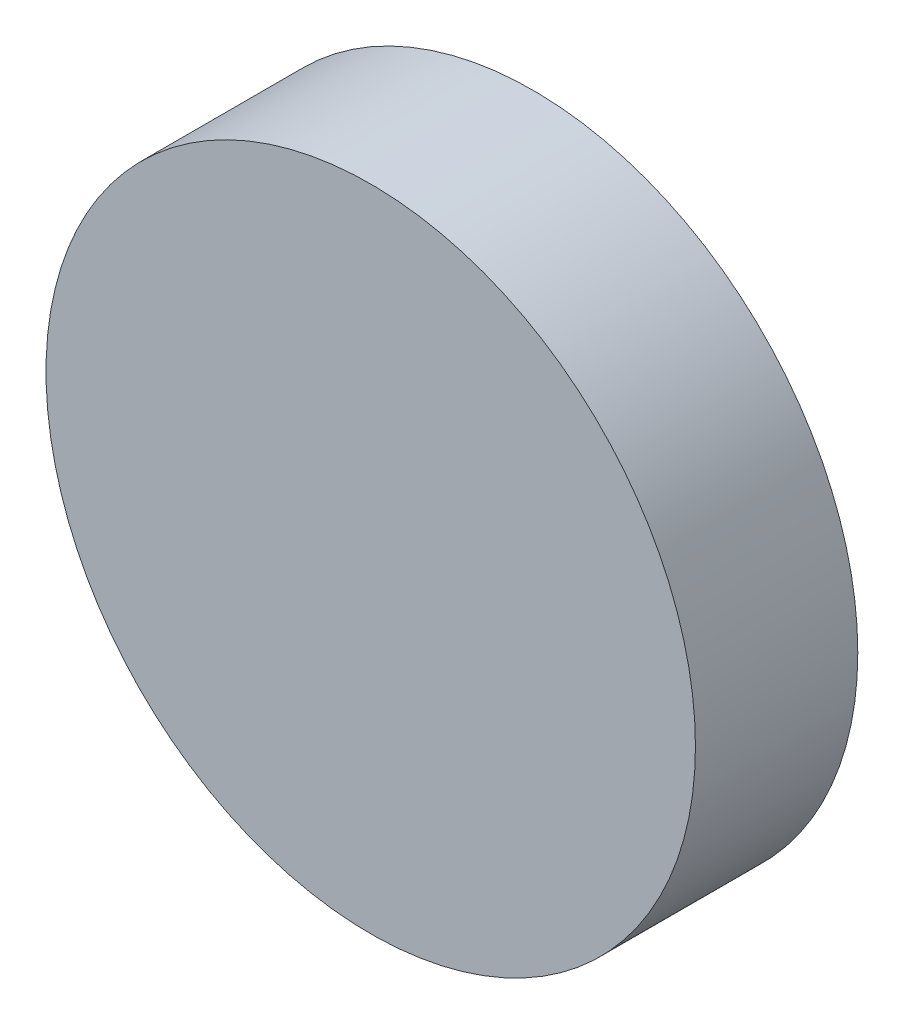
ISO-10303-21;
HEADER;
FILE_DESCRIPTION(('STEP AP214'),'2;1');
FILE_NAME('part.step','',(''),(''),'','','');
FILE_SCHEMA(('AUTOMOTIVE_DESIGN { 1 0 10303 214 1 1 1 1 }'));
ENDSEC;
DATA;
#1=APPLICATION_CONTEXT('core data for automotive mechanical design processes');
#2=APPLICATION_PROTOCOL_DEFINITION('international standard','automotive_design',2000,#1);
#3=PRODUCT_CONTEXT('',#1,'mechanical');
#4=PRODUCT('Part','Part','',(#3));
#5=PRODUCT_RELATED_PRODUCT_CATEGORY('part','',(#4));
#6=PRODUCT_DEFINITION_FORMATION('','',#4);
#7=PRODUCT_DEFINITION_CONTEXT('part definition',#1,'design');
#8=PRODUCT_DEFINITION('design','',#6,#7);
#9=PRODUCT_DEFINITION_SHAPE('','',#8);
#10=(LENGTH_UNIT() NAMED_UNIT(*) SI_UNIT(.MILLI.,.METRE.));
#11=(NAMED_UNIT(*) PLANE_ANGLE_UNIT() SI_UNIT($,.RADIAN.));
#12=(NAMED_UNIT(*) SI_UNIT($,.STERADIAN.) SOLID_ANGLE_UNIT());
#13=UNCERTAINTY_MEASURE_WITH_UNIT(LENGTH_MEASURE(1.E-05),#10,'distance_accuracy_value','');
#14=(GEOMETRIC_REPRESENTATION_CONTEXT(3) GLOBAL_UNCERTAINTY_ASSIGNED_CONTEXT((#13)) GLOBAL_UNIT_ASSIGNED_CONTEXT((#10,
#11,#12)) REPRESENTATION_CONTEXT('',''));
#15=CARTESIAN_POINT('',(0.,0.,0.));
#16=DIRECTION('',(0.,0.,1.));
#17=DIRECTION('',(1.,0.,0.));
#18=AXIS2_PLACEMENT_3D('',#15,#16,#17);
#19=CARTESIAN_POINT('',(66.5,-2.43727261258631,15.));
#20=DIRECTION('',(0.,0.,-1.));
#21=DIRECTION('',(-1.,0.,0.));
#22=AXIS2_PLACEMENT_3D('',#19,#20,#21);
#23=CYLINDRICAL_SURFACE('',#22,30.);
#24=CARTESIAN_POINT('',(66.5,-2.43727261258631,15.));
#25=DIRECTION('',(0.,0.,1.));
#26=DIRECTION('',(1.,0.,0.));
#27=AXIS2_PLACEMENT_3D('',#24,#25,#26);
#28=CIRCLE('',#27,30.);
#29=CARTESIAN_POINT('',(96.5,-2.43727261258631,15.));
#30=VERTEX_POINT('',#29);
#31=EDGE_CURVE('E10',#30,#30,#28,.T.);
#32=ORIENTED_EDGE('',*,*,#31,.F.);
#33=EDGE_LOOP('',(#32));
#34=FACE_BOUND('',#33,.T.);
#35=CARTESIAN_POINT('',(66.5,-2.43727261258631,0.));
#36=DIRECTION('',(0.,0.,1.));
#37=DIRECTION('',(1.,0.,0.));
#38=AXIS2_PLACEMENT_3D('',#35,#36,#37);
#39=CIRCLE('',#38,30.);
#40=CARTESIAN_POINT('',(96.5,-2.43727261258631,0.));
#41=VERTEX_POINT('',#40);
#42=EDGE_CURVE('E34',#41,#41,#39,.T.);
#43=ORIENTED_EDGE('',*,*,#42,.T.);
#44=EDGE_LOOP('',(#43));
#45=FACE_BOUND('',#44,.T.);
#46=ADVANCED_FACE('F31',(#34,#45),#23,.T.);
#47=CARTESIAN_POINT('',(66.5,-2.43727261258631,15.));
#48=DIRECTION('',(0.,0.,1.));
#49=DIRECTION('',(1.,0.,0.));
#50=AXIS2_PLACEMENT_3D('',#47,#48,#49);
#51=PLANE('',#50);
#52=ORIENTED_EDGE('',*,*,#31,.T.);
#53=EDGE_LOOP('',(#52));
#54=FACE_BOUND('',#53,.T.);
#55=ADVANCED_FACE('F46',(#54),#51,.T.);
#56=CARTESIAN_POINT('',(66.5,-2.43727261258631,0.));
#57=DIRECTION('',(0.,0.,1.));
#58=DIRECTION('',(1.,0.,0.));
#59=AXIS2_PLACEMENT_3D('',#56,#57,#58);
#60=PLANE('',#59);
#61=ORIENTED_EDGE('',*,*,#42,.F.);
#62=EDGE_LOOP('',(#61));
#63=FACE_BOUND('',#62,.T.);
#64=ADVANCED_FACE('F44',(#63),#60,.F.);
#65=CLOSED_SHELL('',(#46,#55,#64));
#66=MANIFOLD_SOLID_BREP('B2',#65);
#67=ADVANCED_BREP_SHAPE_REPRESENTATION('',(#18,#66),#14);
#68=SHAPE_DEFINITION_REPRESENTATION(#9,#67);
ENDSEC;
END-ISO-10303-21;
